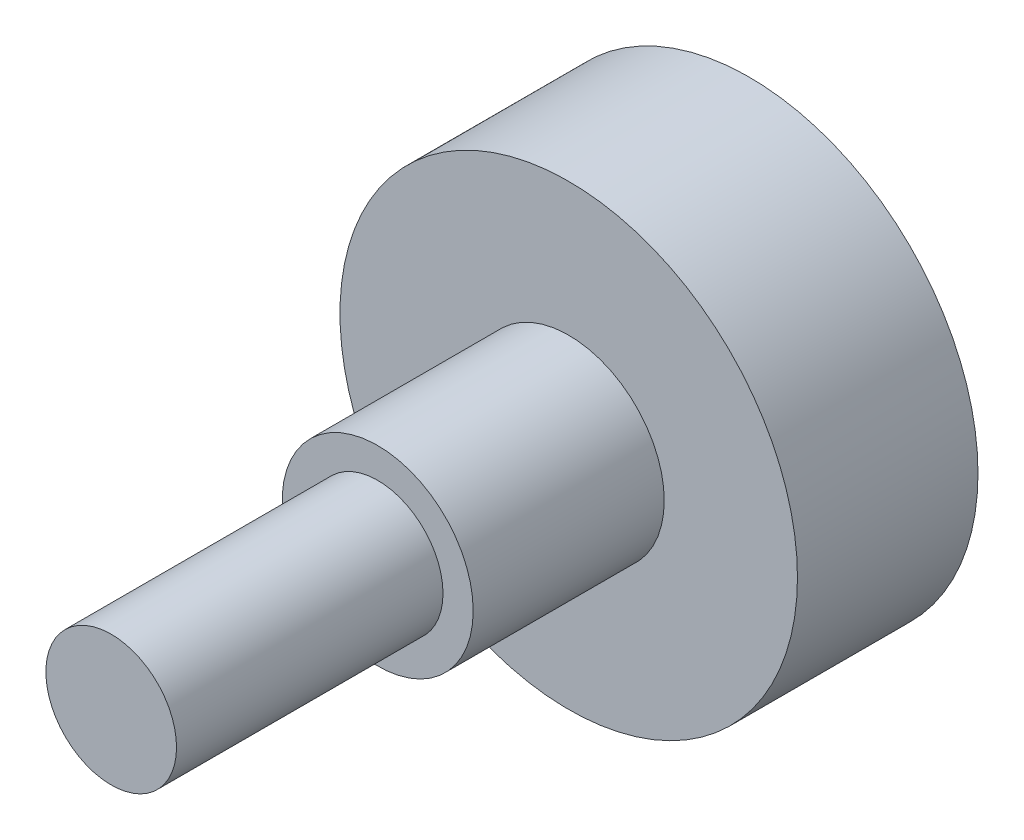
ISO-10303-21;
HEADER;
FILE_DESCRIPTION(('STEP AP214'),'2;1');
FILE_NAME('part.step','',(''),(''),'','','');
FILE_SCHEMA(('AUTOMOTIVE_DESIGN { 1 0 10303 214 1 1 1 1 }'));
ENDSEC;
DATA;
#1=APPLICATION_CONTEXT('core data for automotive mechanical design processes');
#2=APPLICATION_PROTOCOL_DEFINITION('international standard','automotive_design',2000,#1);
#3=PRODUCT_CONTEXT('',#1,'mechanical');
#4=PRODUCT('Part','Part','',(#3));
#5=PRODUCT_RELATED_PRODUCT_CATEGORY('part','',(#4));
#6=PRODUCT_DEFINITION_FORMATION('','',#4);
#7=PRODUCT_DEFINITION_CONTEXT('part definition',#1,'design');
#8=PRODUCT_DEFINITION('design','',#6,#7);
#9=PRODUCT_DEFINITION_SHAPE('','',#8);
#10=(LENGTH_UNIT() NAMED_UNIT(*) SI_UNIT(.MILLI.,.METRE.));
#11=(NAMED_UNIT(*) PLANE_ANGLE_UNIT() SI_UNIT($,.RADIAN.));
#12=(NAMED_UNIT(*) SI_UNIT($,.STERADIAN.) SOLID_ANGLE_UNIT());
#13=UNCERTAINTY_MEASURE_WITH_UNIT(LENGTH_MEASURE(1.E-05),#10,'distance_accuracy_value','');
#14=(GEOMETRIC_REPRESENTATION_CONTEXT(3) GLOBAL_UNCERTAINTY_ASSIGNED_CONTEXT((#13)) GLOBAL_UNIT_ASSIGNED_CONTEXT((#10,
#11,#12)) REPRESENTATION_CONTEXT('',''));
#15=CARTESIAN_POINT('',(0.,0.,0.));
#16=DIRECTION('',(0.,0.,1.));
#17=DIRECTION('',(1.,0.,0.));
#18=AXIS2_PLACEMENT_3D('',#15,#16,#17);
#19=CARTESIAN_POINT('',(0.,0.,30.96));
#20=DIRECTION('',(0.,0.,-1.));
#21=DIRECTION('',(-1.,0.,0.));
#22=AXIS2_PLACEMENT_3D('',#19,#20,#21);
#23=CYLINDRICAL_SURFACE('',#22,4.635);
#24=CARTESIAN_POINT('',(0.,0.,8.76));
#25=DIRECTION('',(0.,0.,1.));
#26=DIRECTION('',(1.,0.,0.));
#27=AXIS2_PLACEMENT_3D('',#24,#25,#26);
#28=CIRCLE('',#27,4.635);
#29=CARTESIAN_POINT('',(4.635,0.,8.76));
#30=VERTEX_POINT('',#29);
#31=EDGE_CURVE('E11',#30,#30,#28,.T.);
#32=ORIENTED_EDGE('',*,*,#31,.T.);
#33=EDGE_LOOP('',(#32));
#34=FACE_BOUND('',#33,.T.);
#35=CARTESIAN_POINT('',(0.,0.,18.03));
#36=DIRECTION('',(0.,0.,1.));
#37=DIRECTION('',(1.,0.,0.));
#38=AXIS2_PLACEMENT_3D('',#35,#36,#37);
#39=CIRCLE('',#38,4.635);
#40=CARTESIAN_POINT('',(4.635,0.,18.03));
#41=VERTEX_POINT('',#40);
#42=EDGE_CURVE('E47',#41,#41,#39,.T.);
#43=ORIENTED_EDGE('',*,*,#42,.F.);
#44=EDGE_LOOP('',(#43));
#45=FACE_BOUND('',#44,.T.);
#46=ADVANCED_FACE('F41',(#34,#45),#23,.T.);
#47=CARTESIAN_POINT('',(0.,0.,8.76));
#48=DIRECTION('',(0.,0.,1.));
#49=DIRECTION('',(1.,0.,0.));
#50=AXIS2_PLACEMENT_3D('',#47,#48,#49);
#51=PLANE('',#50);
#52=ORIENTED_EDGE('',*,*,#31,.F.);
#53=EDGE_LOOP('',(#52));
#54=FACE_BOUND('',#53,.T.);
#55=ADVANCED_FACE('F73',(#54),#51,.F.);
#56=CARTESIAN_POINT('',(0.,0.,18.03));
#57=DIRECTION('',(0.,0.,1.));
#58=DIRECTION('',(1.,0.,0.));
#59=AXIS2_PLACEMENT_3D('',#56,#57,#58);
#60=PLANE('',#59);
#61=CARTESIAN_POINT('',(0.,0.,18.03));
#62=DIRECTION('',(0.,0.,1.));
#63=DIRECTION('',(1.,0.,0.));
#64=AXIS2_PLACEMENT_3D('',#61,#62,#63);
#65=CIRCLE('',#64,3.17);
#66=CARTESIAN_POINT('',(3.17,0.,18.03));
#67=VERTEX_POINT('',#66);
#68=EDGE_CURVE('E51',#67,#67,#65,.T.);
#69=ORIENTED_EDGE('',*,*,#68,.F.);
#70=EDGE_LOOP('',(#69));
#71=FACE_BOUND('',#70,.T.);
#72=ORIENTED_EDGE('',*,*,#42,.T.);
#73=EDGE_LOOP('',(#72));
#74=FACE_BOUND('',#73,.T.);
#75=ADVANCED_FACE('F65',(#71,#74),#60,.T.);
#76=CARTESIAN_POINT('',(0.,0.,18.03));
#77=DIRECTION('',(0.,0.,1.));
#78=DIRECTION('',(1.,0.,0.));
#79=AXIS2_PLACEMENT_3D('',#76,#77,#78);
#80=CYLINDRICAL_SURFACE('',#79,3.17);
#81=ORIENTED_EDGE('',*,*,#68,.T.);
#82=EDGE_LOOP('',(#81));
#83=FACE_BOUND('',#82,.T.);
#84=CARTESIAN_POINT('',(0.,0.,30.96));
#85=DIRECTION('',(0.,0.,1.));
#86=DIRECTION('',(1.,0.,0.));
#87=AXIS2_PLACEMENT_3D('',#84,#85,#86);
#88=CIRCLE('',#87,3.17);
#89=CARTESIAN_POINT('',(3.17,0.,30.96));
#90=VERTEX_POINT('',#89);
#91=EDGE_CURVE('E55',#90,#90,#88,.T.);
#92=ORIENTED_EDGE('',*,*,#91,.F.);
#93=EDGE_LOOP('',(#92));
#94=FACE_BOUND('',#93,.T.);
#95=ADVANCED_FACE('F63',(#83,#94),#80,.T.);
#96=CARTESIAN_POINT('',(0.,0.,30.96));
#97=DIRECTION('',(0.,0.,1.));
#98=DIRECTION('',(1.,0.,0.));
#99=AXIS2_PLACEMENT_3D('',#96,#97,#98);
#100=PLANE('',#99);
#101=ORIENTED_EDGE('',*,*,#91,.T.);
#102=EDGE_LOOP('',(#101));
#103=FACE_BOUND('',#102,.T.);
#104=ADVANCED_FACE('F61',(#103),#100,.T.);
#105=CLOSED_SHELL('',(#46,#55,#75,#95,#104));
#106=MANIFOLD_SOLID_BREP('B2',#105);
#107=CARTESIAN_POINT('',(0.,0.,8.76));
#108=DIRECTION('',(0.,0.,-1.));
#109=DIRECTION('',(-1.,0.,0.));
#110=AXIS2_PLACEMENT_3D('',#107,#108,#109);
#111=CYLINDRICAL_SURFACE('',#110,4.635);
#112=CARTESIAN_POINT('',(0.,0.,8.76));
#113=DIRECTION('',(0.,0.,1.));
#114=DIRECTION('',(1.,0.,0.));
#115=AXIS2_PLACEMENT_3D('',#112,#113,#114);
#116=CIRCLE('',#115,4.635);
#117=CARTESIAN_POINT('',(4.635,0.,8.76));
#118=VERTEX_POINT('',#117);
#119=EDGE_CURVE('E119',#118,#118,#116,.T.);
#120=ORIENTED_EDGE('',*,*,#119,.T.);
#121=EDGE_LOOP('',(#120));
#122=FACE_BOUND('',#121,.T.);
#123=CARTESIAN_POINT('',(0.,0.,0.));
#124=DIRECTION('',(0.,0.,1.));
#125=DIRECTION('',(1.,0.,0.));
#126=AXIS2_PLACEMENT_3D('',#123,#124,#125);
#127=CIRCLE('',#126,4.635);
#128=CARTESIAN_POINT('',(4.635,0.,0.));
#129=VERTEX_POINT('',#128);
#130=EDGE_CURVE('E125',#129,#129,#127,.T.);
#131=ORIENTED_EDGE('',*,*,#130,.F.);
#132=EDGE_LOOP('',(#131));
#133=FACE_BOUND('',#132,.T.);
#134=ADVANCED_FACE('F112',(#122,#133),#111,.F.);
#135=CARTESIAN_POINT('',(0.,0.,8.76));
#136=DIRECTION('',(0.,0.,-1.));
#137=DIRECTION('',(-1.,0.,0.));
#138=AXIS2_PLACEMENT_3D('',#135,#136,#137);
#139=CYLINDRICAL_SURFACE('',#138,11.1);
#140=CARTESIAN_POINT('',(0.,0.,8.76));
#141=DIRECTION('',(0.,0.,1.));
#142=DIRECTION('',(1.,0.,0.));
#143=AXIS2_PLACEMENT_3D('',#140,#141,#142);
#144=CIRCLE('',#143,11.1);
#145=CARTESIAN_POINT('',(11.1,0.,8.76));
#146=VERTEX_POINT('',#145);
#147=EDGE_CURVE('E40',#146,#146,#144,.T.);
#148=ORIENTED_EDGE('',*,*,#147,.F.);
#149=EDGE_LOOP('',(#148));
#150=FACE_BOUND('',#149,.T.);
#151=CARTESIAN_POINT('',(0.,0.,0.));
#152=DIRECTION('',(0.,0.,1.));
#153=DIRECTION('',(1.,0.,0.));
#154=AXIS2_PLACEMENT_3D('',#151,#152,#153);
#155=CIRCLE('',#154,11.1);
#156=CARTESIAN_POINT('',(11.1,0.,0.));
#157=VERTEX_POINT('',#156);
#158=EDGE_CURVE('E115',#157,#157,#155,.T.);
#159=ORIENTED_EDGE('',*,*,#158,.T.);
#160=EDGE_LOOP('',(#159));
#161=FACE_BOUND('',#160,.T.);
#162=ADVANCED_FACE('F132',(#150,#161),#139,.T.);
#163=CARTESIAN_POINT('',(0.,-24.5614213562373,8.76));
#164=DIRECTION('',(0.,0.,1.));
#165=DIRECTION('',(1.,0.,0.));
#166=AXIS2_PLACEMENT_3D('',#163,#164,#165);
#167=PLANE('',#166);
#168=ORIENTED_EDGE('',*,*,#119,.F.);
#169=EDGE_LOOP('',(#168));
#170=FACE_BOUND('',#169,.T.);
#171=ORIENTED_EDGE('',*,*,#147,.T.);
#172=EDGE_LOOP('',(#171));
#173=FACE_BOUND('',#172,.T.);
#174=ADVANCED_FACE('F136',(#170,#173),#167,.T.);
#175=CARTESIAN_POINT('',(0.,-24.5614213562373,0.));
#176=DIRECTION('',(0.,0.,1.));
#177=DIRECTION('',(1.,0.,0.));
#178=AXIS2_PLACEMENT_3D('',#175,#176,#177);
#179=PLANE('',#178);
#180=ORIENTED_EDGE('',*,*,#130,.T.);
#181=EDGE_LOOP('',(#180));
#182=FACE_BOUND('',#181,.T.);
#183=ORIENTED_EDGE('',*,*,#158,.F.);
#184=EDGE_LOOP('',(#183));
#185=FACE_BOUND('',#184,.T.);
#186=ADVANCED_FACE('F134',(#182,#185),#179,.F.);
#187=CLOSED_SHELL('',(#134,#162,#174,#186));
#188=MANIFOLD_SOLID_BREP('B6',#187);
#189=ADVANCED_BREP_SHAPE_REPRESENTATION('',(#18,#106,#188),#14);
#190=SHAPE_DEFINITION_REPRESENTATION(#9,#189);
ENDSEC;
END-ISO-10303-21;
